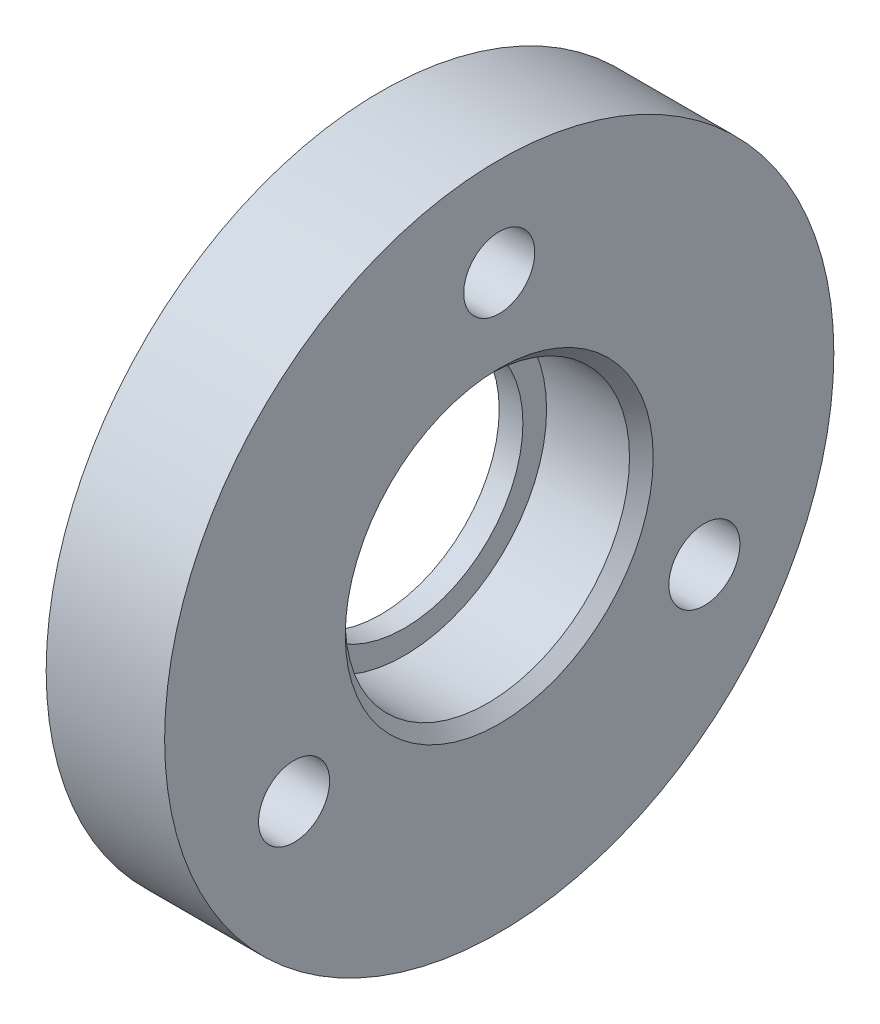
ISO-10303-21;
HEADER;
FILE_DESCRIPTION(('STEP AP214'),'2;1');
FILE_NAME('part.step','',(''),(''),'','','');
FILE_SCHEMA(('AUTOMOTIVE_DESIGN { 1 0 10303 214 1 1 1 1 }'));
ENDSEC;
DATA;
#1=APPLICATION_CONTEXT('core data for automotive mechanical design processes');
#2=APPLICATION_PROTOCOL_DEFINITION('international standard','automotive_design',2000,#1);
#3=PRODUCT_CONTEXT('',#1,'mechanical');
#4=PRODUCT('Part','Part','',(#3));
#5=PRODUCT_RELATED_PRODUCT_CATEGORY('part','',(#4));
#6=PRODUCT_DEFINITION_FORMATION('','',#4);
#7=PRODUCT_DEFINITION_CONTEXT('part definition',#1,'design');
#8=PRODUCT_DEFINITION('design','',#6,#7);
#9=PRODUCT_DEFINITION_SHAPE('','',#8);
#10=(LENGTH_UNIT() NAMED_UNIT(*) SI_UNIT(.MILLI.,.METRE.));
#11=(NAMED_UNIT(*) PLANE_ANGLE_UNIT() SI_UNIT($,.RADIAN.));
#12=(NAMED_UNIT(*) SI_UNIT($,.STERADIAN.) SOLID_ANGLE_UNIT());
#13=UNCERTAINTY_MEASURE_WITH_UNIT(LENGTH_MEASURE(1.E-05),#10,'distance_accuracy_value','');
#14=(GEOMETRIC_REPRESENTATION_CONTEXT(3) GLOBAL_UNCERTAINTY_ASSIGNED_CONTEXT((#13)) GLOBAL_UNIT_ASSIGNED_CONTEXT((#10,
#11,#12)) REPRESENTATION_CONTEXT('',''));
#15=CARTESIAN_POINT('',(0.,0.,0.));
#16=DIRECTION('',(0.,0.,1.));
#17=DIRECTION('',(1.,0.,0.));
#18=AXIS2_PLACEMENT_3D('',#15,#16,#17);
#19=CARTESIAN_POINT('',(5.,0.,0.));
#20=DIRECTION('',(1.,0.,0.));
#21=DIRECTION('',(0.,0.,-1.));
#22=AXIS2_PLACEMENT_3D('',#19,#20,#21);
#23=PLANE('',#22);
#24=CARTESIAN_POINT('',(5.,0.,0.));
#25=DIRECTION('',(1.,0.,0.));
#26=DIRECTION('',(0.,0.,-1.));
#27=AXIS2_PLACEMENT_3D('',#24,#25,#26);
#28=CIRCLE('',#27,6.50000000000001);
#29=CARTESIAN_POINT('',(5.,0.,-6.50000000000001));
#30=VERTEX_POINT('',#29);
#31=EDGE_CURVE('E10',#30,#30,#28,.F.);
#32=ORIENTED_EDGE('',*,*,#31,.T.);
#33=EDGE_LOOP('',(#32));
#34=FACE_BOUND('',#33,.T.);
#35=CARTESIAN_POINT('',(5.,10.,0.));
#36=DIRECTION('',(1.,0.,0.));
#37=DIRECTION('',(0.,0.,-1.));
#38=AXIS2_PLACEMENT_3D('',#35,#36,#37);
#39=CIRCLE('',#38,1.5);
#40=CARTESIAN_POINT('',(5.,10.,-1.5));
#41=VERTEX_POINT('',#40);
#42=EDGE_CURVE('E67',#41,#41,#39,.T.);
#43=ORIENTED_EDGE('',*,*,#42,.F.);
#44=EDGE_LOOP('',(#43));
#45=FACE_BOUND('',#44,.T.);
#46=CARTESIAN_POINT('',(5.,-4.99999999999967,-8.66025403784496));
#47=DIRECTION('',(1.,0.,0.));
#48=DIRECTION('',(0.,0.,-1.));
#49=AXIS2_PLACEMENT_3D('',#46,#47,#48);
#50=CIRCLE('',#49,1.5);
#51=CARTESIAN_POINT('',(5.,-4.99999999999967,-10.160254037845));
#52=VERTEX_POINT('',#51);
#53=EDGE_CURVE('E82',#52,#52,#50,.T.);
#54=ORIENTED_EDGE('',*,*,#53,.F.);
#55=EDGE_LOOP('',(#54));
#56=FACE_BOUND('',#55,.T.);
#57=CARTESIAN_POINT('',(5.,-5.00000000000033,8.66025403784382));
#58=DIRECTION('',(1.,0.,0.));
#59=DIRECTION('',(0.,0.,-1.));
#60=AXIS2_PLACEMENT_3D('',#57,#58,#59);
#61=CIRCLE('',#60,1.5);
#62=CARTESIAN_POINT('',(5.,-5.00000000000033,7.16025403784382));
#63=VERTEX_POINT('',#62);
#64=EDGE_CURVE('E79',#63,#63,#61,.T.);
#65=ORIENTED_EDGE('',*,*,#64,.F.);
#66=EDGE_LOOP('',(#65));
#67=FACE_BOUND('',#66,.T.);
#68=CARTESIAN_POINT('',(5.,0.,0.));
#69=DIRECTION('',(1.,0.,0.));
#70=DIRECTION('',(0.,0.,-1.));
#71=AXIS2_PLACEMENT_3D('',#68,#69,#70);
#72=CIRCLE('',#71,14.125);
#73=CARTESIAN_POINT('',(5.,0.,-14.125));
#74=VERTEX_POINT('',#73);
#75=EDGE_CURVE('E55',#74,#74,#72,.T.);
#76=ORIENTED_EDGE('',*,*,#75,.T.);
#77=EDGE_LOOP('',(#76));
#78=FACE_BOUND('',#77,.T.);
#79=ADVANCED_FACE('F39',(#34,#45,#56,#67,#78),#23,.T.);
#80=CARTESIAN_POINT('',(0.,0.,0.));
#81=DIRECTION('',(1.,0.,0.));
#82=DIRECTION('',(0.,0.,-1.));
#83=AXIS2_PLACEMENT_3D('',#80,#81,#82);
#84=PLANE('',#83);
#85=CARTESIAN_POINT('',(0.,10.,0.));
#86=DIRECTION('',(1.,0.,0.));
#87=DIRECTION('',(0.,0.,-1.));
#88=AXIS2_PLACEMENT_3D('',#85,#86,#87);
#89=CIRCLE('',#88,1.5);
#90=CARTESIAN_POINT('',(0.,10.,-1.5));
#91=VERTEX_POINT('',#90);
#92=EDGE_CURVE('E58',#91,#91,#89,.T.);
#93=ORIENTED_EDGE('',*,*,#92,.T.);
#94=EDGE_LOOP('',(#93));
#95=FACE_BOUND('',#94,.T.);
#96=CARTESIAN_POINT('',(0.,-4.99999999999967,-8.66025403784496));
#97=DIRECTION('',(1.,0.,0.));
#98=DIRECTION('',(0.,0.,-1.));
#99=AXIS2_PLACEMENT_3D('',#96,#97,#98);
#100=CIRCLE('',#99,1.5);
#101=CARTESIAN_POINT('',(0.,-4.99999999999967,-10.160254037845));
#102=VERTEX_POINT('',#101);
#103=EDGE_CURVE('E62',#102,#102,#100,.T.);
#104=ORIENTED_EDGE('',*,*,#103,.T.);
#105=EDGE_LOOP('',(#104));
#106=FACE_BOUND('',#105,.T.);
#107=CARTESIAN_POINT('',(0.,-5.00000000000033,8.66025403784382));
#108=DIRECTION('',(1.,0.,0.));
#109=DIRECTION('',(0.,0.,-1.));
#110=AXIS2_PLACEMENT_3D('',#107,#108,#109);
#111=CIRCLE('',#110,1.5);
#112=CARTESIAN_POINT('',(0.,-5.00000000000033,7.16025403784382));
#113=VERTEX_POINT('',#112);
#114=EDGE_CURVE('E65',#113,#113,#111,.T.);
#115=ORIENTED_EDGE('',*,*,#114,.T.);
#116=EDGE_LOOP('',(#115));
#117=FACE_BOUND('',#116,.T.);
#118=CARTESIAN_POINT('',(0.,0.,0.));
#119=DIRECTION('',(1.,0.,0.));
#120=DIRECTION('',(0.,0.,-1.));
#121=AXIS2_PLACEMENT_3D('',#118,#119,#120);
#122=CIRCLE('',#121,14.125);
#123=CARTESIAN_POINT('',(0.,0.,-14.125));
#124=VERTEX_POINT('',#123);
#125=EDGE_CURVE('E69',#124,#124,#122,.T.);
#126=ORIENTED_EDGE('',*,*,#125,.F.);
#127=EDGE_LOOP('',(#126));
#128=FACE_BOUND('',#127,.T.);
#129=CARTESIAN_POINT('',(0.,0.,0.));
#130=DIRECTION('',(1.,0.,0.));
#131=DIRECTION('',(0.,0.,-1.));
#132=AXIS2_PLACEMENT_3D('',#129,#130,#131);
#133=CIRCLE('',#132,5.);
#134=CARTESIAN_POINT('',(0.,0.,-5.));
#135=VERTEX_POINT('',#134);
#136=EDGE_CURVE('E61',#135,#135,#133,.T.);
#137=ORIENTED_EDGE('',*,*,#136,.T.);
#138=EDGE_LOOP('',(#137));
#139=FACE_BOUND('',#138,.T.);
#140=ADVANCED_FACE('F93',(#95,#106,#117,#128,#139),#84,.F.);
#141=CARTESIAN_POINT('',(5.,0.,0.));
#142=DIRECTION('',(-1.,0.,0.));
#143=DIRECTION('',(0.,0.,1.));
#144=AXIS2_PLACEMENT_3D('',#141,#142,#143);
#145=CYLINDRICAL_SURFACE('',#144,14.125);
#146=ORIENTED_EDGE('',*,*,#75,.F.);
#147=EDGE_LOOP('',(#146));
#148=FACE_BOUND('',#147,.T.);
#149=ORIENTED_EDGE('',*,*,#125,.T.);
#150=EDGE_LOOP('',(#149));
#151=FACE_BOUND('',#150,.T.);
#152=ADVANCED_FACE('F101',(#148,#151),#145,.T.);
#153=CARTESIAN_POINT('',(5.,0.,0.));
#154=DIRECTION('',(-1.,0.,0.));
#155=DIRECTION('',(0.,0.,1.));
#156=AXIS2_PLACEMENT_3D('',#153,#154,#155);
#157=CYLINDRICAL_SURFACE('',#156,6.);
#158=CARTESIAN_POINT('',(4.5,0.,0.));
#159=DIRECTION('',(1.,0.,0.));
#160=DIRECTION('',(0.,0.,-1.));
#161=AXIS2_PLACEMENT_3D('',#158,#159,#160);
#162=CIRCLE('',#161,6.);
#163=CARTESIAN_POINT('',(4.5,0.,-6.));
#164=VERTEX_POINT('',#163);
#165=EDGE_CURVE('E47',#164,#164,#162,.T.);
#166=ORIENTED_EDGE('',*,*,#165,.T.);
#167=EDGE_LOOP('',(#166));
#168=FACE_BOUND('',#167,.T.);
#169=CARTESIAN_POINT('',(1.,0.,0.));
#170=DIRECTION('',(1.,0.,0.));
#171=DIRECTION('',(0.,0.,-1.));
#172=AXIS2_PLACEMENT_3D('',#169,#170,#171);
#173=CIRCLE('',#172,6.);
#174=CARTESIAN_POINT('',(1.,0.,-6.));
#175=VERTEX_POINT('',#174);
#176=EDGE_CURVE('E51',#175,#175,#173,.T.);
#177=ORIENTED_EDGE('',*,*,#176,.F.);
#178=EDGE_LOOP('',(#177));
#179=FACE_BOUND('',#178,.T.);
#180=ADVANCED_FACE('F104',(#168,#179),#157,.F.);
#181=CARTESIAN_POINT('',(1.,0.,0.));
#182=DIRECTION('',(1.,0.,0.));
#183=DIRECTION('',(0.,0.,-1.));
#184=AXIS2_PLACEMENT_3D('',#181,#182,#183);
#185=PLANE('',#184);
#186=ORIENTED_EDGE('',*,*,#176,.T.);
#187=EDGE_LOOP('',(#186));
#188=FACE_BOUND('',#187,.T.);
#189=CARTESIAN_POINT('',(1.,0.,0.));
#190=DIRECTION('',(1.,0.,0.));
#191=DIRECTION('',(0.,0.,-1.));
#192=AXIS2_PLACEMENT_3D('',#189,#190,#191);
#193=CIRCLE('',#192,5.);
#194=CARTESIAN_POINT('',(1.,0.,-5.));
#195=VERTEX_POINT('',#194);
#196=EDGE_CURVE('E72',#195,#195,#193,.T.);
#197=ORIENTED_EDGE('',*,*,#196,.F.);
#198=EDGE_LOOP('',(#197));
#199=FACE_BOUND('',#198,.T.);
#200=ADVANCED_FACE('F116',(#188,#199),#185,.T.);
#201=CARTESIAN_POINT('',(1.,0.,0.));
#202=DIRECTION('',(-1.,0.,0.));
#203=DIRECTION('',(0.,0.,1.));
#204=AXIS2_PLACEMENT_3D('',#201,#202,#203);
#205=CYLINDRICAL_SURFACE('',#204,5.);
#206=ORIENTED_EDGE('',*,*,#196,.T.);
#207=EDGE_LOOP('',(#206));
#208=FACE_BOUND('',#207,.T.);
#209=ORIENTED_EDGE('',*,*,#136,.F.);
#210=EDGE_LOOP('',(#209));
#211=FACE_BOUND('',#210,.T.);
#212=ADVANCED_FACE('F113',(#208,#211),#205,.F.);
#213=CARTESIAN_POINT('',(-5.,-5.00000000000033,8.66025403784382));
#214=DIRECTION('',(1.,0.,0.));
#215=DIRECTION('',(0.,0.,-1.));
#216=AXIS2_PLACEMENT_3D('',#213,#214,#215);
#217=CYLINDRICAL_SURFACE('',#216,1.5);
#218=ORIENTED_EDGE('',*,*,#64,.T.);
#219=EDGE_LOOP('',(#218));
#220=FACE_BOUND('',#219,.T.);
#221=ORIENTED_EDGE('',*,*,#114,.F.);
#222=EDGE_LOOP('',(#221));
#223=FACE_BOUND('',#222,.T.);
#224=ADVANCED_FACE('F115',(#220,#223),#217,.F.);
#225=CARTESIAN_POINT('',(-5.,-4.99999999999967,-8.66025403784496));
#226=DIRECTION('',(1.,0.,0.));
#227=DIRECTION('',(0.,0.,-1.));
#228=AXIS2_PLACEMENT_3D('',#225,#226,#227);
#229=CYLINDRICAL_SURFACE('',#228,1.5);
#230=ORIENTED_EDGE('',*,*,#53,.T.);
#231=EDGE_LOOP('',(#230));
#232=FACE_BOUND('',#231,.T.);
#233=ORIENTED_EDGE('',*,*,#103,.F.);
#234=EDGE_LOOP('',(#233));
#235=FACE_BOUND('',#234,.T.);
#236=ADVANCED_FACE('F123',(#232,#235),#229,.F.);
#237=CARTESIAN_POINT('',(-5.,10.,0.));
#238=DIRECTION('',(1.,0.,0.));
#239=DIRECTION('',(0.,0.,-1.));
#240=AXIS2_PLACEMENT_3D('',#237,#238,#239);
#241=CYLINDRICAL_SURFACE('',#240,1.5);
#242=ORIENTED_EDGE('',*,*,#42,.T.);
#243=EDGE_LOOP('',(#242));
#244=FACE_BOUND('',#243,.T.);
#245=ORIENTED_EDGE('',*,*,#92,.F.);
#246=EDGE_LOOP('',(#245));
#247=FACE_BOUND('',#246,.T.);
#248=ADVANCED_FACE('F88',(#244,#247),#241,.F.);
#249=CARTESIAN_POINT('',(4.5,0.,0.));
#250=DIRECTION('',(1.,0.,0.));
#251=DIRECTION('',(0.,0.,-1.));
#252=AXIS2_PLACEMENT_3D('',#249,#250,#251);
#253=CONICAL_SURFACE('',#252,6.,0.785398163397459);
#254=ORIENTED_EDGE('',*,*,#31,.F.);
#255=EDGE_LOOP('',(#254));
#256=FACE_BOUND('',#255,.T.);
#257=ORIENTED_EDGE('',*,*,#165,.F.);
#258=EDGE_LOOP('',(#257));
#259=FACE_BOUND('',#258,.T.);
#260=ADVANCED_FACE('F42',(#256,#259),#253,.F.);
#261=CLOSED_SHELL('',(#79,#140,#152,#180,#200,#212,#224,#236,#248,#260));
#262=MANIFOLD_SOLID_BREP('B2',#261);
#263=ADVANCED_BREP_SHAPE_REPRESENTATION('',(#18,#262),#14);
#264=SHAPE_DEFINITION_REPRESENTATION(#9,#263);
ENDSEC;
END-ISO-10303-21;
